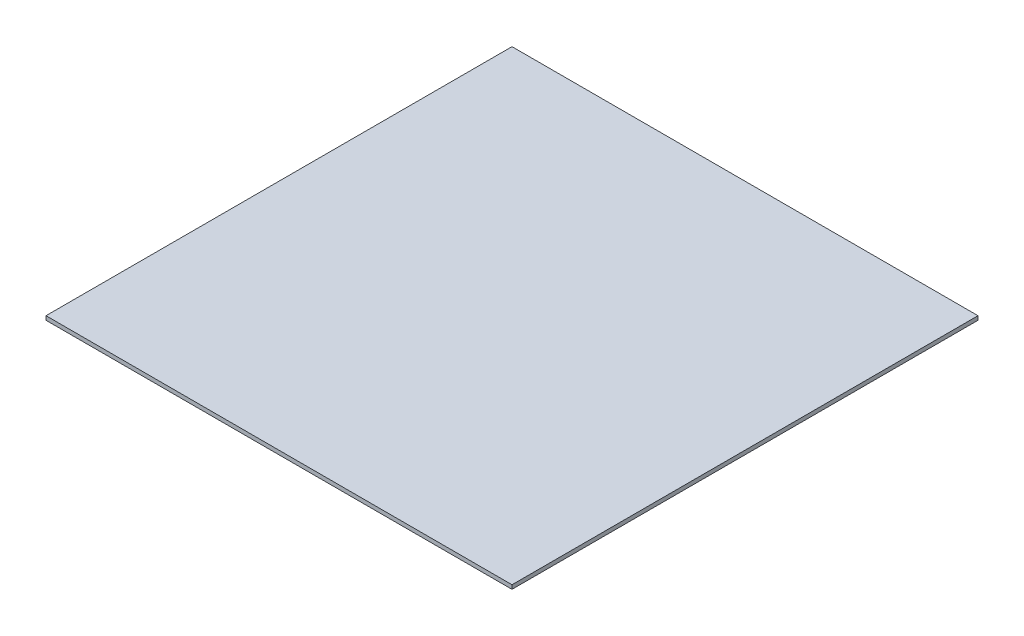
ISO-10303-21;
HEADER;
FILE_DESCRIPTION(('STEP AP214'),'2;1');
FILE_NAME('part.step','',(''),(''),'','','');
FILE_SCHEMA(('AUTOMOTIVE_DESIGN { 1 0 10303 214 1 1 1 1 }'));
ENDSEC;
DATA;
#1=APPLICATION_CONTEXT('core data for automotive mechanical design processes');
#2=APPLICATION_PROTOCOL_DEFINITION('international standard','automotive_design',2000,#1);
#3=PRODUCT_CONTEXT('',#1,'mechanical');
#4=PRODUCT('Part','Part','',(#3));
#5=PRODUCT_RELATED_PRODUCT_CATEGORY('part','',(#4));
#6=PRODUCT_DEFINITION_FORMATION('','',#4);
#7=PRODUCT_DEFINITION_CONTEXT('part definition',#1,'design');
#8=PRODUCT_DEFINITION('design','',#6,#7);
#9=PRODUCT_DEFINITION_SHAPE('','',#8);
#10=(LENGTH_UNIT() NAMED_UNIT(*) SI_UNIT(.MILLI.,.METRE.));
#11=(NAMED_UNIT(*) PLANE_ANGLE_UNIT() SI_UNIT($,.RADIAN.));
#12=(NAMED_UNIT(*) SI_UNIT($,.STERADIAN.) SOLID_ANGLE_UNIT());
#13=UNCERTAINTY_MEASURE_WITH_UNIT(LENGTH_MEASURE(1.E-05),#10,'distance_accuracy_value','');
#14=(GEOMETRIC_REPRESENTATION_CONTEXT(3) GLOBAL_UNCERTAINTY_ASSIGNED_CONTEXT((#13)) GLOBAL_UNIT_ASSIGNED_CONTEXT((#10,
#11,#12)) REPRESENTATION_CONTEXT('',''));
#15=CARTESIAN_POINT('',(0.,0.,0.));
#16=DIRECTION('',(0.,0.,1.));
#17=DIRECTION('',(1.,0.,0.));
#18=AXIS2_PLACEMENT_3D('',#15,#16,#17);
#19=CARTESIAN_POINT('',(350.,6.,-350.));
#20=DIRECTION('',(-1.,0.,0.));
#21=DIRECTION('',(0.,0.,1.));
#22=AXIS2_PLACEMENT_3D('',#19,#20,#21);
#23=PLANE('',#22);
#24=DIRECTION('',(0.,0.,-1.));
#25=VECTOR('',#24,1.);
#26=CARTESIAN_POINT('',(350.,0.,-350.));
#27=LINE('',#26,#25);
#28=CARTESIAN_POINT('',(350.,0.,350.));
#29=VERTEX_POINT('',#28);
#30=CARTESIAN_POINT('',(350.,0.,-350.));
#31=VERTEX_POINT('',#30);
#32=EDGE_CURVE('E105',#29,#31,#27,.T.);
#33=ORIENTED_EDGE('',*,*,#32,.T.);
#34=DIRECTION('',(0.,-1.,0.));
#35=VECTOR('',#34,1.);
#36=CARTESIAN_POINT('',(350.,6.,-350.));
#37=LINE('',#36,#35);
#38=CARTESIAN_POINT('',(350.,6.,-350.));
#39=VERTEX_POINT('',#38);
#40=EDGE_CURVE('E11',#39,#31,#37,.T.);
#41=ORIENTED_EDGE('',*,*,#40,.F.);
#42=DIRECTION('',(0.,0.,-1.));
#43=VECTOR('',#42,1.);
#44=CARTESIAN_POINT('',(350.,6.,-350.));
#45=LINE('',#44,#43);
#46=CARTESIAN_POINT('',(350.,6.,350.));
#47=VERTEX_POINT('',#46);
#48=EDGE_CURVE('E89',#47,#39,#45,.T.);
#49=ORIENTED_EDGE('',*,*,#48,.F.);
#50=DIRECTION('',(0.,-1.,0.));
#51=VECTOR('',#50,1.);
#52=CARTESIAN_POINT('',(350.,6.,350.));
#53=LINE('',#52,#51);
#54=EDGE_CURVE('E97',#47,#29,#53,.T.);
#55=ORIENTED_EDGE('',*,*,#54,.T.);
#56=EDGE_LOOP('',(#33,#41,#49,#55));
#57=FACE_BOUND('',#56,.T.);
#58=ADVANCED_FACE('F39',(#57),#23,.F.);
#59=CARTESIAN_POINT('',(-350.,6.,-350.));
#60=DIRECTION('',(0.,0.,1.));
#61=DIRECTION('',(1.,0.,0.));
#62=AXIS2_PLACEMENT_3D('',#59,#60,#61);
#63=PLANE('',#62);
#64=DIRECTION('',(-1.,0.,0.));
#65=VECTOR('',#64,1.);
#66=CARTESIAN_POINT('',(-350.,0.,-350.));
#67=LINE('',#66,#65);
#68=CARTESIAN_POINT('',(-350.,0.,-350.));
#69=VERTEX_POINT('',#68);
#70=EDGE_CURVE('E92',#31,#69,#67,.T.);
#71=ORIENTED_EDGE('',*,*,#70,.T.);
#72=DIRECTION('',(0.,-1.,0.));
#73=VECTOR('',#72,1.);
#74=CARTESIAN_POINT('',(-350.,6.,-350.));
#75=LINE('',#74,#73);
#76=CARTESIAN_POINT('',(-350.,6.,-350.));
#77=VERTEX_POINT('',#76);
#78=EDGE_CURVE('E50',#77,#69,#75,.T.);
#79=ORIENTED_EDGE('',*,*,#78,.F.);
#80=DIRECTION('',(-1.,0.,0.));
#81=VECTOR('',#80,1.);
#82=CARTESIAN_POINT('',(-350.,6.,-350.));
#83=LINE('',#82,#81);
#84=EDGE_CURVE('E82',#39,#77,#83,.T.);
#85=ORIENTED_EDGE('',*,*,#84,.F.);
#86=ORIENTED_EDGE('',*,*,#40,.T.);
#87=EDGE_LOOP('',(#71,#79,#85,#86));
#88=FACE_BOUND('',#87,.T.);
#89=ADVANCED_FACE('F93',(#88),#63,.F.);
#90=CARTESIAN_POINT('',(-350.,6.,-350.));
#91=DIRECTION('',(1.,0.,0.));
#92=DIRECTION('',(0.,0.,-1.));
#93=AXIS2_PLACEMENT_3D('',#90,#91,#92);
#94=PLANE('',#93);
#95=DIRECTION('',(0.,0.,1.));
#96=VECTOR('',#95,1.);
#97=CARTESIAN_POINT('',(-350.,0.,-350.));
#98=LINE('',#97,#96);
#99=CARTESIAN_POINT('',(-350.,0.,350.));
#100=VERTEX_POINT('',#99);
#101=EDGE_CURVE('E72',#69,#100,#98,.T.);
#102=ORIENTED_EDGE('',*,*,#101,.T.);
#103=DIRECTION('',(0.,-1.,0.));
#104=VECTOR('',#103,1.);
#105=CARTESIAN_POINT('',(-350.,6.,350.));
#106=LINE('',#105,#104);
#107=CARTESIAN_POINT('',(-350.,6.,350.));
#108=VERTEX_POINT('',#107);
#109=EDGE_CURVE('E94',#108,#100,#106,.T.);
#110=ORIENTED_EDGE('',*,*,#109,.F.);
#111=DIRECTION('',(0.,0.,1.));
#112=VECTOR('',#111,1.);
#113=CARTESIAN_POINT('',(-350.,6.,-350.));
#114=LINE('',#113,#112);
#115=EDGE_CURVE('E88',#77,#108,#114,.T.);
#116=ORIENTED_EDGE('',*,*,#115,.F.);
#117=ORIENTED_EDGE('',*,*,#78,.T.);
#118=EDGE_LOOP('',(#102,#110,#116,#117));
#119=FACE_BOUND('',#118,.T.);
#120=ADVANCED_FACE('F96',(#119),#94,.F.);
#121=CARTESIAN_POINT('',(-350.,6.,350.));
#122=DIRECTION('',(0.,0.,-1.));
#123=DIRECTION('',(-1.,0.,0.));
#124=AXIS2_PLACEMENT_3D('',#121,#122,#123);
#125=PLANE('',#124);
#126=DIRECTION('',(1.,0.,0.));
#127=VECTOR('',#126,1.);
#128=CARTESIAN_POINT('',(-350.,0.,350.));
#129=LINE('',#128,#127);
#130=EDGE_CURVE('E76',#100,#29,#129,.T.);
#131=ORIENTED_EDGE('',*,*,#130,.T.);
#132=ORIENTED_EDGE('',*,*,#54,.F.);
#133=DIRECTION('',(1.,0.,0.));
#134=VECTOR('',#133,1.);
#135=CARTESIAN_POINT('',(-350.,6.,350.));
#136=LINE('',#135,#134);
#137=EDGE_CURVE('E54',#108,#47,#136,.T.);
#138=ORIENTED_EDGE('',*,*,#137,.F.);
#139=ORIENTED_EDGE('',*,*,#109,.T.);
#140=EDGE_LOOP('',(#131,#132,#138,#139));
#141=FACE_BOUND('',#140,.T.);
#142=ADVANCED_FACE('F108',(#141),#125,.F.);
#143=CARTESIAN_POINT('',(0.,6.,0.));
#144=DIRECTION('',(0.,1.,0.));
#145=DIRECTION('',(0.,0.,1.));
#146=AXIS2_PLACEMENT_3D('',#143,#144,#145);
#147=PLANE('',#146);
#148=ORIENTED_EDGE('',*,*,#48,.T.);
#149=ORIENTED_EDGE('',*,*,#84,.T.);
#150=ORIENTED_EDGE('',*,*,#115,.T.);
#151=ORIENTED_EDGE('',*,*,#137,.T.);
#152=EDGE_LOOP('',(#148,#149,#150,#151));
#153=FACE_BOUND('',#152,.T.);
#154=ADVANCED_FACE('F86',(#153),#147,.T.);
#155=CARTESIAN_POINT('',(0.,0.,0.));
#156=DIRECTION('',(0.,1.,0.));
#157=DIRECTION('',(0.,0.,1.));
#158=AXIS2_PLACEMENT_3D('',#155,#156,#157);
#159=PLANE('',#158);
#160=ORIENTED_EDGE('',*,*,#32,.F.);
#161=ORIENTED_EDGE('',*,*,#130,.F.);
#162=ORIENTED_EDGE('',*,*,#101,.F.);
#163=ORIENTED_EDGE('',*,*,#70,.F.);
#164=EDGE_LOOP('',(#160,#161,#162,#163));
#165=FACE_BOUND('',#164,.T.);
#166=ADVANCED_FACE('F115',(#165),#159,.F.);
#167=CLOSED_SHELL('',(#58,#89,#120,#142,#154,#166));
#168=MANIFOLD_SOLID_BREP('B2',#167);
#169=ADVANCED_BREP_SHAPE_REPRESENTATION('',(#18,#168),#14);
#170=SHAPE_DEFINITION_REPRESENTATION(#9,#169);
ENDSEC;
END-ISO-10303-21;
